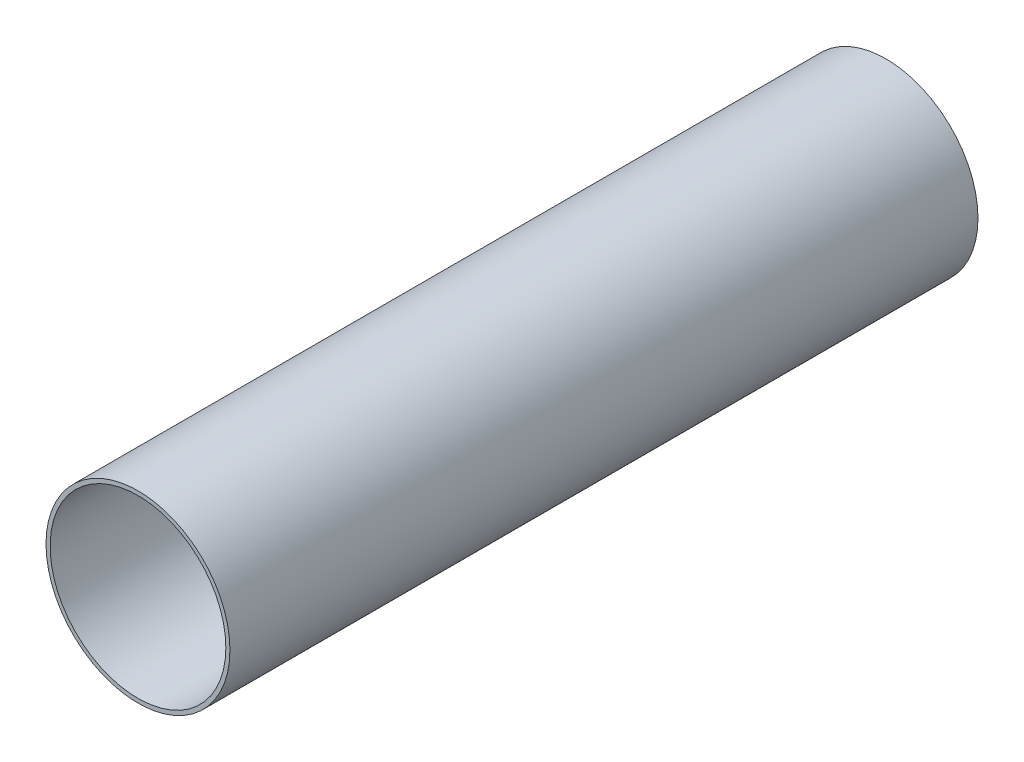
ISO-10303-21;
HEADER;
FILE_DESCRIPTION(('STEP AP214'),'2;1');
FILE_NAME('part.step','',(''),(''),'','','');
FILE_SCHEMA(('AUTOMOTIVE_DESIGN { 1 0 10303 214 1 1 1 1 }'));
ENDSEC;
DATA;
#1=APPLICATION_CONTEXT('core data for automotive mechanical design processes');
#2=APPLICATION_PROTOCOL_DEFINITION('international standard','automotive_design',2000,#1);
#3=PRODUCT_CONTEXT('',#1,'mechanical');
#4=PRODUCT('Part','Part','',(#3));
#5=PRODUCT_RELATED_PRODUCT_CATEGORY('part','',(#4));
#6=PRODUCT_DEFINITION_FORMATION('','',#4);
#7=PRODUCT_DEFINITION_CONTEXT('part definition',#1,'design');
#8=PRODUCT_DEFINITION('design','',#6,#7);
#9=PRODUCT_DEFINITION_SHAPE('','',#8);
#10=(LENGTH_UNIT() NAMED_UNIT(*) SI_UNIT(.MILLI.,.METRE.));
#11=(NAMED_UNIT(*) PLANE_ANGLE_UNIT() SI_UNIT($,.RADIAN.));
#12=(NAMED_UNIT(*) SI_UNIT($,.STERADIAN.) SOLID_ANGLE_UNIT());
#13=UNCERTAINTY_MEASURE_WITH_UNIT(LENGTH_MEASURE(1.E-05),#10,'distance_accuracy_value','');
#14=(GEOMETRIC_REPRESENTATION_CONTEXT(3) GLOBAL_UNCERTAINTY_ASSIGNED_CONTEXT((#13)) GLOBAL_UNIT_ASSIGNED_CONTEXT((#10,
#11,#12)) REPRESENTATION_CONTEXT('',''));
#15=CARTESIAN_POINT('',(0.,0.,0.));
#16=DIRECTION('',(0.,0.,1.));
#17=DIRECTION('',(1.,0.,0.));
#18=AXIS2_PLACEMENT_3D('',#15,#16,#17);
#19=CARTESIAN_POINT('',(0.,0.,273.7));
#20=DIRECTION('',(0.,0.,1.));
#21=DIRECTION('',(1.,0.,0.));
#22=AXIS2_PLACEMENT_3D('',#19,#20,#21);
#23=PLANE('',#22);
#24=CARTESIAN_POINT('',(0.,0.,273.7));
#25=DIRECTION('',(0.,0.,1.));
#26=DIRECTION('',(1.,0.,0.));
#27=AXIS2_PLACEMENT_3D('',#24,#25,#26);
#28=CIRCLE('',#27,33.65);
#29=CARTESIAN_POINT('',(33.65,0.,273.7));
#30=VERTEX_POINT('',#29);
#31=EDGE_CURVE('E10',#30,#30,#28,.T.);
#32=ORIENTED_EDGE('',*,*,#31,.T.);
#33=EDGE_LOOP('',(#32));
#34=FACE_BOUND('',#33,.T.);
#35=CARTESIAN_POINT('',(0.,0.,273.7));
#36=DIRECTION('',(0.,0.,1.));
#37=DIRECTION('',(1.,0.,0.));
#38=AXIS2_PLACEMENT_3D('',#35,#36,#37);
#39=CIRCLE('',#38,32.15);
#40=CARTESIAN_POINT('',(32.15,0.,273.7));
#41=VERTEX_POINT('',#40);
#42=EDGE_CURVE('E56',#41,#41,#39,.T.);
#43=ORIENTED_EDGE('',*,*,#42,.F.);
#44=EDGE_LOOP('',(#43));
#45=FACE_BOUND('',#44,.T.);
#46=ADVANCED_FACE('F43',(#34,#45),#23,.T.);
#47=CARTESIAN_POINT('',(0.,0.,0.));
#48=DIRECTION('',(0.,0.,1.));
#49=DIRECTION('',(1.,0.,0.));
#50=AXIS2_PLACEMENT_3D('',#47,#48,#49);
#51=PLANE('',#50);
#52=CARTESIAN_POINT('',(0.,0.,0.));
#53=DIRECTION('',(0.,0.,1.));
#54=DIRECTION('',(1.,0.,0.));
#55=AXIS2_PLACEMENT_3D('',#52,#53,#54);
#56=CIRCLE('',#55,33.65);
#57=CARTESIAN_POINT('',(33.65,0.,0.));
#58=VERTEX_POINT('',#57);
#59=EDGE_CURVE('E47',#58,#58,#56,.T.);
#60=ORIENTED_EDGE('',*,*,#59,.F.);
#61=EDGE_LOOP('',(#60));
#62=FACE_BOUND('',#61,.T.);
#63=CARTESIAN_POINT('',(0.,0.,0.));
#64=DIRECTION('',(0.,0.,1.));
#65=DIRECTION('',(1.,0.,0.));
#66=AXIS2_PLACEMENT_3D('',#63,#64,#65);
#67=CIRCLE('',#66,32.15);
#68=CARTESIAN_POINT('',(32.15,0.,0.));
#69=VERTEX_POINT('',#68);
#70=EDGE_CURVE('E58',#69,#69,#67,.T.);
#71=ORIENTED_EDGE('',*,*,#70,.T.);
#72=EDGE_LOOP('',(#71));
#73=FACE_BOUND('',#72,.T.);
#74=ADVANCED_FACE('F70',(#62,#73),#51,.F.);
#75=CARTESIAN_POINT('',(0.,0.,273.7));
#76=DIRECTION('',(0.,0.,-1.));
#77=DIRECTION('',(-1.,0.,0.));
#78=AXIS2_PLACEMENT_3D('',#75,#76,#77);
#79=CYLINDRICAL_SURFACE('',#78,33.65);
#80=ORIENTED_EDGE('',*,*,#31,.F.);
#81=EDGE_LOOP('',(#80));
#82=FACE_BOUND('',#81,.T.);
#83=ORIENTED_EDGE('',*,*,#59,.T.);
#84=EDGE_LOOP('',(#83));
#85=FACE_BOUND('',#84,.T.);
#86=ADVANCED_FACE('F45',(#82,#85),#79,.T.);
#87=CARTESIAN_POINT('',(0.,0.,273.7));
#88=DIRECTION('',(0.,0.,-1.));
#89=DIRECTION('',(-1.,0.,0.));
#90=AXIS2_PLACEMENT_3D('',#87,#88,#89);
#91=CYLINDRICAL_SURFACE('',#90,32.15);
#92=ORIENTED_EDGE('',*,*,#42,.T.);
#93=EDGE_LOOP('',(#92));
#94=FACE_BOUND('',#93,.T.);
#95=ORIENTED_EDGE('',*,*,#70,.F.);
#96=EDGE_LOOP('',(#95));
#97=FACE_BOUND('',#96,.T.);
#98=ADVANCED_FACE('F66',(#94,#97),#91,.F.);
#99=CLOSED_SHELL('',(#46,#74,#86,#98));
#100=MANIFOLD_SOLID_BREP('B2',#99);
#101=ADVANCED_BREP_SHAPE_REPRESENTATION('',(#18,#100),#14);
#102=SHAPE_DEFINITION_REPRESENTATION(#9,#101);
ENDSEC;
END-ISO-10303-21;
